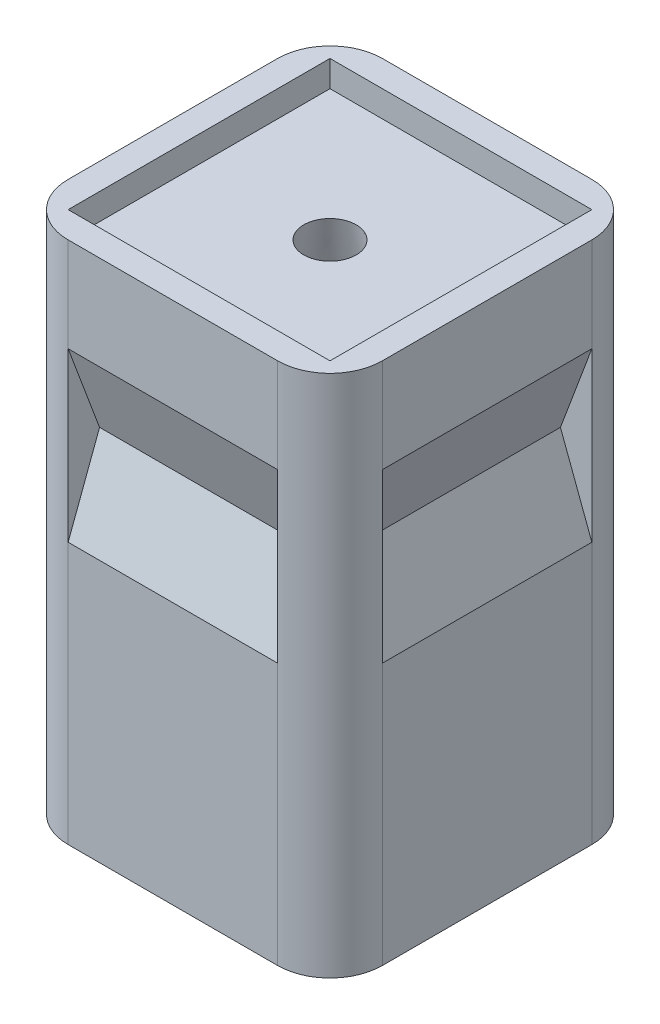
ISO-10303-21;
HEADER;
FILE_DESCRIPTION(('STEP AP214'),'2;1');
FILE_NAME('part.step','',(''),(''),'','','');
FILE_SCHEMA(('AUTOMOTIVE_DESIGN { 1 0 10303 214 1 1 1 1 }'));
ENDSEC;
DATA;
#1=APPLICATION_CONTEXT('core data for automotive mechanical design processes');
#2=APPLICATION_PROTOCOL_DEFINITION('international standard','automotive_design',2000,#1);
#3=PRODUCT_CONTEXT('',#1,'mechanical');
#4=PRODUCT('Part','Part','',(#3));
#5=PRODUCT_RELATED_PRODUCT_CATEGORY('part','',(#4));
#6=PRODUCT_DEFINITION_FORMATION('','',#4);
#7=PRODUCT_DEFINITION_CONTEXT('part definition',#1,'design');
#8=PRODUCT_DEFINITION('design','',#6,#7);
#9=PRODUCT_DEFINITION_SHAPE('','',#8);
#10=(LENGTH_UNIT() NAMED_UNIT(*) SI_UNIT(.MILLI.,.METRE.));
#11=(NAMED_UNIT(*) PLANE_ANGLE_UNIT() SI_UNIT($,.RADIAN.));
#12=(NAMED_UNIT(*) SI_UNIT($,.STERADIAN.) SOLID_ANGLE_UNIT());
#13=UNCERTAINTY_MEASURE_WITH_UNIT(LENGTH_MEASURE(1.E-05),#10,'distance_accuracy_value','');
#14=(GEOMETRIC_REPRESENTATION_CONTEXT(3) GLOBAL_UNCERTAINTY_ASSIGNED_CONTEXT((#13)) GLOBAL_UNIT_ASSIGNED_CONTEXT((#10,
#11,#12)) REPRESENTATION_CONTEXT('',''));
#15=CARTESIAN_POINT('',(0.,0.,0.));
#16=DIRECTION('',(0.,0.,1.));
#17=DIRECTION('',(1.,0.,0.));
#18=AXIS2_PLACEMENT_3D('',#15,#16,#17);
#19=CARTESIAN_POINT('',(-15.,50.,15.));
#20=DIRECTION('',(1.,0.,0.));
#21=DIRECTION('',(0.,0.,-1.));
#22=AXIS2_PLACEMENT_3D('',#19,#20,#21);
#23=PLANE('',#22);
#24=DIRECTION('',(0.,0.,-1.));
#25=VECTOR('',#24,1.);
#26=CARTESIAN_POINT('',(-14.9999999999999,41.,10.0000000000002));
#27=LINE('',#26,#25);
#28=CARTESIAN_POINT('',(-14.9999999999999,41.,10.0000000000002));
#29=VERTEX_POINT('',#28);
#30=CARTESIAN_POINT('',(-15.0000000000001,41.,-9.99999999999984));
#31=VERTEX_POINT('',#30);
#32=EDGE_CURVE('E225',#29,#31,#27,.T.);
#33=ORIENTED_EDGE('',*,*,#32,.F.);
#34=DIRECTION('',(0.,-1.,0.));
#35=VECTOR('',#34,1.);
#36=CARTESIAN_POINT('',(-15.,50.,10.));
#37=LINE('',#36,#35);
#38=CARTESIAN_POINT('',(-15.,50.,10.));
#39=VERTEX_POINT('',#38);
#40=EDGE_CURVE('E407',#29,#39,#37,.F.);
#41=ORIENTED_EDGE('',*,*,#40,.T.);
#42=DIRECTION('',(0.,0.,1.));
#43=VECTOR('',#42,1.);
#44=CARTESIAN_POINT('',(-15.,50.,15.));
#45=LINE('',#44,#43);
#46=CARTESIAN_POINT('',(-15.,50.,-10.));
#47=VERTEX_POINT('',#46);
#48=EDGE_CURVE('E352',#47,#39,#45,.T.);
#49=ORIENTED_EDGE('',*,*,#48,.F.);
#50=DIRECTION('',(0.,-1.,0.));
#51=VECTOR('',#50,1.);
#52=CARTESIAN_POINT('',(-15.,50.,-10.));
#53=LINE('',#52,#51);
#54=EDGE_CURVE('E12',#47,#31,#53,.T.);
#55=ORIENTED_EDGE('',*,*,#54,.T.);
#56=EDGE_LOOP('',(#33,#41,#49,#55));
#57=FACE_BOUND('',#56,.T.);
#58=ADVANCED_FACE('F41',(#57),#23,.F.);
#59=CARTESIAN_POINT('',(-15.,50.,-15.));
#60=DIRECTION('',(0.,0.,1.));
#61=DIRECTION('',(1.,0.,0.));
#62=AXIS2_PLACEMENT_3D('',#59,#60,#61);
#63=PLANE('',#62);
#64=DIRECTION('',(1.,0.,0.));
#65=VECTOR('',#64,1.);
#66=CARTESIAN_POINT('',(-10.,41.,-15.));
#67=LINE('',#66,#65);
#68=CARTESIAN_POINT('',(-10.,41.,-15.));
#69=VERTEX_POINT('',#68);
#70=CARTESIAN_POINT('',(10.,41.,-15.));
#71=VERTEX_POINT('',#70);
#72=EDGE_CURVE('E239',#69,#71,#67,.T.);
#73=ORIENTED_EDGE('',*,*,#72,.F.);
#74=DIRECTION('',(0.,-1.,0.));
#75=VECTOR('',#74,1.);
#76=CARTESIAN_POINT('',(-10.,50.,-15.));
#77=LINE('',#76,#75);
#78=CARTESIAN_POINT('',(-10.,50.,-15.));
#79=VERTEX_POINT('',#78);
#80=EDGE_CURVE('E358',#69,#79,#77,.F.);
#81=ORIENTED_EDGE('',*,*,#80,.T.);
#82=DIRECTION('',(-1.,0.,0.));
#83=VECTOR('',#82,1.);
#84=CARTESIAN_POINT('',(-15.,50.,-15.));
#85=LINE('',#84,#83);
#86=CARTESIAN_POINT('',(10.,50.,-15.));
#87=VERTEX_POINT('',#86);
#88=EDGE_CURVE('E348',#87,#79,#85,.T.);
#89=ORIENTED_EDGE('',*,*,#88,.F.);
#90=DIRECTION('',(0.,-1.,0.));
#91=VECTOR('',#90,1.);
#92=CARTESIAN_POINT('',(10.,50.,-15.));
#93=LINE('',#92,#91);
#94=EDGE_CURVE('E373',#87,#71,#93,.T.);
#95=ORIENTED_EDGE('',*,*,#94,.T.);
#96=EDGE_LOOP('',(#73,#81,#89,#95));
#97=FACE_BOUND('',#96,.T.);
#98=ADVANCED_FACE('F448',(#97),#63,.F.);
#99=CARTESIAN_POINT('',(15.,50.,15.));
#100=DIRECTION('',(-1.,0.,0.));
#101=DIRECTION('',(0.,0.,1.));
#102=AXIS2_PLACEMENT_3D('',#99,#100,#101);
#103=PLANE('',#102);
#104=DIRECTION('',(0.,0.,1.));
#105=VECTOR('',#104,1.);
#106=CARTESIAN_POINT('',(15.,41.,-10.));
#107=LINE('',#106,#105);
#108=CARTESIAN_POINT('',(15.,41.,-10.));
#109=VERTEX_POINT('',#108);
#110=CARTESIAN_POINT('',(15.,41.,9.99999999999995));
#111=VERTEX_POINT('',#110);
#112=EDGE_CURVE('E263',#109,#111,#107,.T.);
#113=ORIENTED_EDGE('',*,*,#112,.F.);
#114=DIRECTION('',(0.,-1.,0.));
#115=VECTOR('',#114,1.);
#116=CARTESIAN_POINT('',(15.,50.,-10.));
#117=LINE('',#116,#115);
#118=CARTESIAN_POINT('',(15.,50.,-10.));
#119=VERTEX_POINT('',#118);
#120=EDGE_CURVE('E388',#109,#119,#117,.F.);
#121=ORIENTED_EDGE('',*,*,#120,.T.);
#122=DIRECTION('',(0.,0.,-1.));
#123=VECTOR('',#122,1.);
#124=CARTESIAN_POINT('',(15.,50.,15.));
#125=LINE('',#124,#123);
#126=CARTESIAN_POINT('',(15.,50.,10.));
#127=VERTEX_POINT('',#126);
#128=EDGE_CURVE('E345',#127,#119,#125,.T.);
#129=ORIENTED_EDGE('',*,*,#128,.F.);
#130=DIRECTION('',(0.,-1.,0.));
#131=VECTOR('',#130,1.);
#132=CARTESIAN_POINT('',(15.,50.,10.));
#133=LINE('',#132,#131);
#134=EDGE_CURVE('E385',#127,#111,#133,.T.);
#135=ORIENTED_EDGE('',*,*,#134,.T.);
#136=EDGE_LOOP('',(#113,#121,#129,#135));
#137=FACE_BOUND('',#136,.T.);
#138=ADVANCED_FACE('F437',(#137),#103,.F.);
#139=CARTESIAN_POINT('',(-15.,50.,15.));
#140=DIRECTION('',(0.,0.,-1.));
#141=DIRECTION('',(-1.,0.,0.));
#142=AXIS2_PLACEMENT_3D('',#139,#140,#141);
#143=PLANE('',#142);
#144=DIRECTION('',(-1.,0.,0.));
#145=VECTOR('',#144,1.);
#146=CARTESIAN_POINT('',(10.,41.,15.));
#147=LINE('',#146,#145);
#148=CARTESIAN_POINT('',(10.,41.,15.));
#149=VERTEX_POINT('',#148);
#150=CARTESIAN_POINT('',(-10.,41.,15.));
#151=VERTEX_POINT('',#150);
#152=EDGE_CURVE('E288',#149,#151,#147,.T.);
#153=ORIENTED_EDGE('',*,*,#152,.F.);
#154=DIRECTION('',(0.,-1.,0.));
#155=VECTOR('',#154,1.);
#156=CARTESIAN_POINT('',(10.,50.,15.));
#157=LINE('',#156,#155);
#158=CARTESIAN_POINT('',(10.,50.,15.));
#159=VERTEX_POINT('',#158);
#160=EDGE_CURVE('E404',#149,#159,#157,.F.);
#161=ORIENTED_EDGE('',*,*,#160,.T.);
#162=DIRECTION('',(1.,0.,0.));
#163=VECTOR('',#162,1.);
#164=CARTESIAN_POINT('',(-15.,50.,15.));
#165=LINE('',#164,#163);
#166=CARTESIAN_POINT('',(-10.,50.,15.));
#167=VERTEX_POINT('',#166);
#168=EDGE_CURVE('E355',#167,#159,#165,.T.);
#169=ORIENTED_EDGE('',*,*,#168,.F.);
#170=DIRECTION('',(0.,-1.,0.));
#171=VECTOR('',#170,1.);
#172=CARTESIAN_POINT('',(-10.,50.,15.));
#173=LINE('',#172,#171);
#174=EDGE_CURVE('E401',#167,#151,#173,.T.);
#175=ORIENTED_EDGE('',*,*,#174,.T.);
#176=EDGE_LOOP('',(#153,#161,#169,#175));
#177=FACE_BOUND('',#176,.T.);
#178=ADVANCED_FACE('F426',(#177),#143,.F.);
#179=CARTESIAN_POINT('',(0.,47.5,0.));
#180=DIRECTION('',(0.,-1.,0.));
#181=DIRECTION('',(0.,0.,-1.));
#182=AXIS2_PLACEMENT_3D('',#179,#180,#181);
#183=PLANE('',#182);
#184=DIRECTION('',(0.,0.,-1.));
#185=VECTOR('',#184,1.);
#186=CARTESIAN_POINT('',(12.5,47.5,12.5));
#187=LINE('',#186,#185);
#188=CARTESIAN_POINT('',(12.5,47.5,12.5));
#189=VERTEX_POINT('',#188);
#190=CARTESIAN_POINT('',(12.5,47.5,-12.5));
#191=VERTEX_POINT('',#190);
#192=EDGE_CURVE('E313',#189,#191,#187,.T.);
#193=ORIENTED_EDGE('',*,*,#192,.T.);
#194=DIRECTION('',(-1.,0.,0.));
#195=VECTOR('',#194,1.);
#196=CARTESIAN_POINT('',(-12.5,47.5,-12.5));
#197=LINE('',#196,#195);
#198=CARTESIAN_POINT('',(-12.5,47.5,-12.5));
#199=VERTEX_POINT('',#198);
#200=EDGE_CURVE('E316',#191,#199,#197,.T.);
#201=ORIENTED_EDGE('',*,*,#200,.T.);
#202=DIRECTION('',(0.,0.,1.));
#203=VECTOR('',#202,1.);
#204=CARTESIAN_POINT('',(-12.5,47.5,12.5));
#205=LINE('',#204,#203);
#206=CARTESIAN_POINT('',(-12.5,47.5,12.5));
#207=VERTEX_POINT('',#206);
#208=EDGE_CURVE('E320',#199,#207,#205,.T.);
#209=ORIENTED_EDGE('',*,*,#208,.T.);
#210=DIRECTION('',(1.,0.,0.));
#211=VECTOR('',#210,1.);
#212=CARTESIAN_POINT('',(-12.5,47.5,12.5));
#213=LINE('',#212,#211);
#214=EDGE_CURVE('E323',#207,#189,#213,.T.);
#215=ORIENTED_EDGE('',*,*,#214,.T.);
#216=EDGE_LOOP('',(#193,#201,#209,#215));
#217=FACE_BOUND('',#216,.T.);
#218=CARTESIAN_POINT('',(0.,47.5,0.));
#219=DIRECTION('',(0.,1.,0.));
#220=DIRECTION('',(0.,0.,1.));
#221=AXIS2_PLACEMENT_3D('',#218,#219,#220);
#222=CIRCLE('',#221,2.5);
#223=CARTESIAN_POINT('',(0.784484004687969,47.5,-2.37372804811097));
#224=VERTEX_POINT('',#223);
#225=EDGE_CURVE('E309',#224,#224,#222,.T.);
#226=ORIENTED_EDGE('',*,*,#225,.F.);
#227=EDGE_LOOP('',(#226));
#228=FACE_BOUND('',#227,.T.);
#229=ADVANCED_FACE('F515',(#217,#228),#183,.F.);
#230=CARTESIAN_POINT('',(15.,0.,-10.));
#231=VERTEX_POINT('',#230);
#232=CARTESIAN_POINT('',(15.,25.,-10.));
#233=VERTEX_POINT('',#232);
#234=EDGE_CURVE('E389',#231,#233,#117,.F.);
#235=ORIENTED_EDGE('',*,*,#234,.T.);
#236=DIRECTION('',(0.,0.,1.));
#237=VECTOR('',#236,1.);
#238=CARTESIAN_POINT('',(15.,25.,-10.));
#239=LINE('',#238,#237);
#240=CARTESIAN_POINT('',(15.,25.0000000000001,10.));
#241=VERTEX_POINT('',#240);
#242=EDGE_CURVE('E264',#233,#241,#239,.T.);
#243=ORIENTED_EDGE('',*,*,#242,.T.);
#244=CARTESIAN_POINT('',(15.,0.,10.));
#245=VERTEX_POINT('',#244);
#246=EDGE_CURVE('E384',#241,#245,#133,.T.);
#247=ORIENTED_EDGE('',*,*,#246,.T.);
#248=DIRECTION('',(0.,0.,-1.));
#249=VECTOR('',#248,1.);
#250=CARTESIAN_POINT('',(15.,0.,15.));
#251=LINE('',#250,#249);
#252=EDGE_CURVE('E338',#245,#231,#251,.T.);
#253=ORIENTED_EDGE('',*,*,#252,.T.);
#254=EDGE_LOOP('',(#235,#243,#247,#253));
#255=FACE_BOUND('',#254,.T.);
#256=ADVANCED_FACE('F510',(#255),#103,.F.);
#257=CARTESIAN_POINT('',(-10.,0.,-15.));
#258=VERTEX_POINT('',#257);
#259=CARTESIAN_POINT('',(-10.,25.,-15.));
#260=VERTEX_POINT('',#259);
#261=EDGE_CURVE('E369',#258,#260,#77,.F.);
#262=ORIENTED_EDGE('',*,*,#261,.T.);
#263=DIRECTION('',(1.,0.,0.));
#264=VECTOR('',#263,1.);
#265=CARTESIAN_POINT('',(-10.,25.,-15.));
#266=LINE('',#265,#264);
#267=CARTESIAN_POINT('',(10.,25.,-15.));
#268=VERTEX_POINT('',#267);
#269=EDGE_CURVE('E240',#260,#268,#266,.T.);
#270=ORIENTED_EDGE('',*,*,#269,.T.);
#271=CARTESIAN_POINT('',(10.,0.,-15.));
#272=VERTEX_POINT('',#271);
#273=EDGE_CURVE('E372',#268,#272,#93,.T.);
#274=ORIENTED_EDGE('',*,*,#273,.T.);
#275=DIRECTION('',(-1.,0.,0.));
#276=VECTOR('',#275,1.);
#277=CARTESIAN_POINT('',(-15.,0.,-15.));
#278=LINE('',#277,#276);
#279=EDGE_CURVE('E361',#272,#258,#278,.T.);
#280=ORIENTED_EDGE('',*,*,#279,.T.);
#281=EDGE_LOOP('',(#262,#270,#274,#280));
#282=FACE_BOUND('',#281,.T.);
#283=ADVANCED_FACE('F502',(#282),#63,.F.);
#284=CARTESIAN_POINT('',(-15.,0.,10.));
#285=VERTEX_POINT('',#284);
#286=CARTESIAN_POINT('',(-14.9999999999999,25.,10.0000000000002));
#287=VERTEX_POINT('',#286);
#288=EDGE_CURVE('E408',#285,#287,#37,.F.);
#289=ORIENTED_EDGE('',*,*,#288,.T.);
#290=DIRECTION('',(0.,0.,-1.));
#291=VECTOR('',#290,1.);
#292=CARTESIAN_POINT('',(-14.9999999999999,25.,10.0000000000002));
#293=LINE('',#292,#291);
#294=CARTESIAN_POINT('',(-15.,25.0000000000003,-10.));
#295=VERTEX_POINT('',#294);
#296=EDGE_CURVE('E210',#287,#295,#293,.T.);
#297=ORIENTED_EDGE('',*,*,#296,.T.);
#298=CARTESIAN_POINT('',(-15.,0.,-10.));
#299=VERTEX_POINT('',#298);
#300=EDGE_CURVE('E49',#295,#299,#53,.T.);
#301=ORIENTED_EDGE('',*,*,#300,.T.);
#302=DIRECTION('',(0.,0.,1.));
#303=VECTOR('',#302,1.);
#304=CARTESIAN_POINT('',(-15.,0.,15.));
#305=LINE('',#304,#303);
#306=EDGE_CURVE('E364',#299,#285,#305,.T.);
#307=ORIENTED_EDGE('',*,*,#306,.T.);
#308=EDGE_LOOP('',(#289,#297,#301,#307));
#309=FACE_BOUND('',#308,.T.);
#310=ADVANCED_FACE('F457',(#309),#23,.F.);
#311=CARTESIAN_POINT('',(10.,0.,15.));
#312=VERTEX_POINT('',#311);
#313=CARTESIAN_POINT('',(10.,25.,15.));
#314=VERTEX_POINT('',#313);
#315=EDGE_CURVE('E405',#312,#314,#157,.F.);
#316=ORIENTED_EDGE('',*,*,#315,.T.);
#317=DIRECTION('',(-1.,0.,0.));
#318=VECTOR('',#317,1.);
#319=CARTESIAN_POINT('',(10.,25.,15.));
#320=LINE('',#319,#318);
#321=CARTESIAN_POINT('',(-10.,25.,15.));
#322=VERTEX_POINT('',#321);
#323=EDGE_CURVE('E289',#314,#322,#320,.T.);
#324=ORIENTED_EDGE('',*,*,#323,.T.);
#325=CARTESIAN_POINT('',(-10.,0.,15.));
#326=VERTEX_POINT('',#325);
#327=EDGE_CURVE('E400',#322,#326,#173,.T.);
#328=ORIENTED_EDGE('',*,*,#327,.T.);
#329=DIRECTION('',(1.,0.,0.));
#330=VECTOR('',#329,1.);
#331=CARTESIAN_POINT('',(-15.,0.,15.));
#332=LINE('',#331,#330);
#333=EDGE_CURVE('E349',#326,#312,#332,.T.);
#334=ORIENTED_EDGE('',*,*,#333,.T.);
#335=EDGE_LOOP('',(#316,#324,#328,#334));
#336=FACE_BOUND('',#335,.T.);
#337=ADVANCED_FACE('F467',(#336),#143,.F.);
#338=CARTESIAN_POINT('',(0.,50.,0.));
#339=DIRECTION('',(0.,-1.,0.));
#340=DIRECTION('',(0.,0.,-1.));
#341=AXIS2_PLACEMENT_3D('',#338,#339,#340);
#342=PLANE('',#341);
#343=DIRECTION('',(-1.,0.,0.));
#344=VECTOR('',#343,1.);
#345=CARTESIAN_POINT('',(-12.5,50.,-12.5));
#346=LINE('',#345,#344);
#347=CARTESIAN_POINT('',(12.5,50.,-12.5));
#348=VERTEX_POINT('',#347);
#349=CARTESIAN_POINT('',(-12.5,50.,-12.5));
#350=VERTEX_POINT('',#349);
#351=EDGE_CURVE('E328',#348,#350,#346,.T.);
#352=ORIENTED_EDGE('',*,*,#351,.F.);
#353=DIRECTION('',(0.,0.,-1.));
#354=VECTOR('',#353,1.);
#355=CARTESIAN_POINT('',(12.5,50.,12.5));
#356=LINE('',#355,#354);
#357=CARTESIAN_POINT('',(12.5,50.,12.5));
#358=VERTEX_POINT('',#357);
#359=EDGE_CURVE('E312',#358,#348,#356,.T.);
#360=ORIENTED_EDGE('',*,*,#359,.F.);
#361=DIRECTION('',(1.,0.,0.));
#362=VECTOR('',#361,1.);
#363=CARTESIAN_POINT('',(-12.5,50.,12.5));
#364=LINE('',#363,#362);
#365=CARTESIAN_POINT('',(-12.5,50.,12.5));
#366=VERTEX_POINT('',#365);
#367=EDGE_CURVE('E317',#366,#358,#364,.T.);
#368=ORIENTED_EDGE('',*,*,#367,.F.);
#369=DIRECTION('',(0.,0.,1.));
#370=VECTOR('',#369,1.);
#371=CARTESIAN_POINT('',(-12.5,50.,12.5));
#372=LINE('',#371,#370);
#373=EDGE_CURVE('E331',#350,#366,#372,.T.);
#374=ORIENTED_EDGE('',*,*,#373,.F.);
#375=EDGE_LOOP('',(#352,#360,#368,#374));
#376=FACE_BOUND('',#375,.T.);
#377=ORIENTED_EDGE('',*,*,#128,.T.);
#378=CARTESIAN_POINT('',(10.,50.,-10.));
#379=DIRECTION('',(0.,-1.,0.));
#380=DIRECTION('',(0.,0.,-1.));
#381=AXIS2_PLACEMENT_3D('',#378,#379,#380);
#382=CIRCLE('',#381,5.);
#383=EDGE_CURVE('E398',#119,#87,#382,.F.);
#384=ORIENTED_EDGE('',*,*,#383,.T.);
#385=ORIENTED_EDGE('',*,*,#88,.T.);
#386=CARTESIAN_POINT('',(-10.,50.,-10.));
#387=DIRECTION('',(0.,-1.,0.));
#388=DIRECTION('',(0.,0.,-1.));
#389=AXIS2_PLACEMENT_3D('',#386,#387,#388);
#390=CIRCLE('',#389,5.);
#391=EDGE_CURVE('E394',#79,#47,#390,.F.);
#392=ORIENTED_EDGE('',*,*,#391,.T.);
#393=ORIENTED_EDGE('',*,*,#48,.T.);
#394=CARTESIAN_POINT('',(-10.,50.,10.));
#395=DIRECTION('',(0.,-1.,0.));
#396=DIRECTION('',(0.,0.,-1.));
#397=AXIS2_PLACEMENT_3D('',#394,#395,#396);
#398=CIRCLE('',#397,5.);
#399=EDGE_CURVE('E392',#39,#167,#398,.F.);
#400=ORIENTED_EDGE('',*,*,#399,.T.);
#401=ORIENTED_EDGE('',*,*,#168,.T.);
#402=CARTESIAN_POINT('',(10.,50.,10.));
#403=DIRECTION('',(0.,-1.,0.));
#404=DIRECTION('',(0.,0.,-1.));
#405=AXIS2_PLACEMENT_3D('',#402,#403,#404);
#406=CIRCLE('',#405,5.);
#407=EDGE_CURVE('E396',#159,#127,#406,.F.);
#408=ORIENTED_EDGE('',*,*,#407,.T.);
#409=EDGE_LOOP('',(#377,#384,#385,#392,#393,#400,#401,#408));
#410=FACE_BOUND('',#409,.T.);
#411=ADVANCED_FACE('F419',(#376,#410),#342,.F.);
#412=CARTESIAN_POINT('',(0.,0.,0.));
#413=DIRECTION('',(0.,-1.,0.));
#414=DIRECTION('',(0.,0.,-1.));
#415=AXIS2_PLACEMENT_3D('',#412,#413,#414);
#416=PLANE('',#415);
#417=CARTESIAN_POINT('',(0.,0.,0.));
#418=DIRECTION('',(0.,-1.,0.));
#419=DIRECTION('',(0.,0.,-1.));
#420=AXIS2_PLACEMENT_3D('',#417,#418,#419);
#421=CIRCLE('',#420,12.5);
#422=CARTESIAN_POINT('',(0.,0.,-12.5));
#423=VERTEX_POINT('',#422);
#424=EDGE_CURVE('E306',#423,#423,#421,.T.);
#425=ORIENTED_EDGE('',*,*,#424,.F.);
#426=EDGE_LOOP('',(#425));
#427=FACE_BOUND('',#426,.T.);
#428=ORIENTED_EDGE('',*,*,#279,.F.);
#429=CARTESIAN_POINT('',(10.,0.,-10.));
#430=DIRECTION('',(0.,-1.,0.));
#431=DIRECTION('',(0.,0.,-1.));
#432=AXIS2_PLACEMENT_3D('',#429,#430,#431);
#433=CIRCLE('',#432,5.);
#434=EDGE_CURVE('E382',#272,#231,#433,.T.);
#435=ORIENTED_EDGE('',*,*,#434,.T.);
#436=ORIENTED_EDGE('',*,*,#252,.F.);
#437=CARTESIAN_POINT('',(10.,0.,10.));
#438=DIRECTION('',(0.,-1.,0.));
#439=DIRECTION('',(0.,0.,-1.));
#440=AXIS2_PLACEMENT_3D('',#437,#438,#439);
#441=CIRCLE('',#440,5.);
#442=EDGE_CURVE('E380',#245,#312,#441,.T.);
#443=ORIENTED_EDGE('',*,*,#442,.T.);
#444=ORIENTED_EDGE('',*,*,#333,.F.);
#445=CARTESIAN_POINT('',(-10.,0.,10.));
#446=DIRECTION('',(0.,-1.,0.));
#447=DIRECTION('',(0.,0.,-1.));
#448=AXIS2_PLACEMENT_3D('',#445,#446,#447);
#449=CIRCLE('',#448,5.);
#450=EDGE_CURVE('E376',#326,#285,#449,.T.);
#451=ORIENTED_EDGE('',*,*,#450,.T.);
#452=ORIENTED_EDGE('',*,*,#306,.F.);
#453=CARTESIAN_POINT('',(-10.,0.,-10.));
#454=DIRECTION('',(0.,-1.,0.));
#455=DIRECTION('',(0.,0.,-1.));
#456=AXIS2_PLACEMENT_3D('',#453,#454,#455);
#457=CIRCLE('',#456,5.);
#458=EDGE_CURVE('E378',#299,#258,#457,.T.);
#459=ORIENTED_EDGE('',*,*,#458,.T.);
#460=EDGE_LOOP('',(#428,#435,#436,#443,#444,#451,#452,#459));
#461=FACE_BOUND('',#460,.T.);
#462=ADVANCED_FACE('F462',(#427,#461),#416,.T.);
#463=CARTESIAN_POINT('',(12.5,47.5,12.5));
#464=DIRECTION('',(1.,0.,0.));
#465=DIRECTION('',(0.,0.,-1.));
#466=AXIS2_PLACEMENT_3D('',#463,#464,#465);
#467=PLANE('',#466);
#468=ORIENTED_EDGE('',*,*,#359,.T.);
#469=DIRECTION('',(0.,1.,0.));
#470=VECTOR('',#469,1.);
#471=CARTESIAN_POINT('',(12.5,47.5,-12.5));
#472=LINE('',#471,#470);
#473=EDGE_CURVE('E326',#191,#348,#472,.T.);
#474=ORIENTED_EDGE('',*,*,#473,.F.);
#475=ORIENTED_EDGE('',*,*,#192,.F.);
#476=DIRECTION('',(0.,1.,0.));
#477=VECTOR('',#476,1.);
#478=CARTESIAN_POINT('',(12.5,47.5,12.5));
#479=LINE('',#478,#477);
#480=EDGE_CURVE('E336',#189,#358,#479,.T.);
#481=ORIENTED_EDGE('',*,*,#480,.T.);
#482=EDGE_LOOP('',(#468,#474,#475,#481));
#483=FACE_BOUND('',#482,.T.);
#484=ADVANCED_FACE('F734',(#483),#467,.F.);
#485=CARTESIAN_POINT('',(-12.5,47.5,12.5));
#486=DIRECTION('',(0.,0.,1.));
#487=DIRECTION('',(1.,0.,0.));
#488=AXIS2_PLACEMENT_3D('',#485,#486,#487);
#489=PLANE('',#488);
#490=ORIENTED_EDGE('',*,*,#367,.T.);
#491=ORIENTED_EDGE('',*,*,#480,.F.);
#492=ORIENTED_EDGE('',*,*,#214,.F.);
#493=DIRECTION('',(0.,1.,0.));
#494=VECTOR('',#493,1.);
#495=CARTESIAN_POINT('',(-12.5,47.5,12.5));
#496=LINE('',#495,#494);
#497=EDGE_CURVE('E339',#207,#366,#496,.T.);
#498=ORIENTED_EDGE('',*,*,#497,.T.);
#499=EDGE_LOOP('',(#490,#491,#492,#498));
#500=FACE_BOUND('',#499,.T.);
#501=ADVANCED_FACE('F725',(#500),#489,.F.);
#502=CARTESIAN_POINT('',(-12.5,47.5,12.5));
#503=DIRECTION('',(-1.,0.,0.));
#504=DIRECTION('',(0.,0.,1.));
#505=AXIS2_PLACEMENT_3D('',#502,#503,#504);
#506=PLANE('',#505);
#507=ORIENTED_EDGE('',*,*,#373,.T.);
#508=ORIENTED_EDGE('',*,*,#497,.F.);
#509=ORIENTED_EDGE('',*,*,#208,.F.);
#510=DIRECTION('',(0.,1.,0.));
#511=VECTOR('',#510,1.);
#512=CARTESIAN_POINT('',(-12.5,47.5,-12.5));
#513=LINE('',#512,#511);
#514=EDGE_CURVE('E341',#199,#350,#513,.T.);
#515=ORIENTED_EDGE('',*,*,#514,.T.);
#516=EDGE_LOOP('',(#507,#508,#509,#515));
#517=FACE_BOUND('',#516,.T.);
#518=ADVANCED_FACE('F716',(#517),#506,.F.);
#519=CARTESIAN_POINT('',(-12.5,47.5,-12.5));
#520=DIRECTION('',(0.,0.,-1.));
#521=DIRECTION('',(-1.,0.,0.));
#522=AXIS2_PLACEMENT_3D('',#519,#520,#521);
#523=PLANE('',#522);
#524=ORIENTED_EDGE('',*,*,#351,.T.);
#525=ORIENTED_EDGE('',*,*,#514,.F.);
#526=ORIENTED_EDGE('',*,*,#200,.F.);
#527=ORIENTED_EDGE('',*,*,#473,.T.);
#528=EDGE_LOOP('',(#524,#525,#526,#527));
#529=FACE_BOUND('',#528,.T.);
#530=ADVANCED_FACE('F520',(#529),#523,.F.);
#531=CARTESIAN_POINT('',(10.,50.,-10.));
#532=DIRECTION('',(0.,-1.,0.));
#533=DIRECTION('',(0.,0.,-1.));
#534=AXIS2_PLACEMENT_3D('',#531,#532,#533);
#535=CYLINDRICAL_SURFACE('',#534,5.);
#536=ORIENTED_EDGE('',*,*,#383,.F.);
#537=ORIENTED_EDGE('',*,*,#120,.F.);
#538=DIRECTION('',(0.,1.,0.));
#539=VECTOR('',#538,1.);
#540=CARTESIAN_POINT('',(15.,41.,-10.));
#541=LINE('',#540,#539);
#542=EDGE_CURVE('E258',#233,#109,#541,.T.);
#543=ORIENTED_EDGE('',*,*,#542,.F.);
#544=ORIENTED_EDGE('',*,*,#234,.F.);
#545=ORIENTED_EDGE('',*,*,#434,.F.);
#546=ORIENTED_EDGE('',*,*,#273,.F.);
#547=DIRECTION('',(0.,1.,0.));
#548=VECTOR('',#547,1.);
#549=CARTESIAN_POINT('',(10.,41.,-15.));
#550=LINE('',#549,#548);
#551=EDGE_CURVE('E64',#268,#71,#550,.T.);
#552=ORIENTED_EDGE('',*,*,#551,.T.);
#553=ORIENTED_EDGE('',*,*,#94,.F.);
#554=EDGE_LOOP('',(#536,#537,#543,#544,#545,#546,#552,#553));
#555=FACE_BOUND('',#554,.T.);
#556=ADVANCED_FACE('F443',(#555),#535,.T.);
#557=CARTESIAN_POINT('',(10.,50.,10.));
#558=DIRECTION('',(0.,-1.,0.));
#559=DIRECTION('',(0.,0.,-1.));
#560=AXIS2_PLACEMENT_3D('',#557,#558,#559);
#561=CYLINDRICAL_SURFACE('',#560,5.);
#562=ORIENTED_EDGE('',*,*,#407,.F.);
#563=ORIENTED_EDGE('',*,*,#160,.F.);
#564=DIRECTION('',(0.,1.,0.));
#565=VECTOR('',#564,1.);
#566=CARTESIAN_POINT('',(10.,41.,15.));
#567=LINE('',#566,#565);
#568=EDGE_CURVE('E283',#314,#149,#567,.T.);
#569=ORIENTED_EDGE('',*,*,#568,.F.);
#570=ORIENTED_EDGE('',*,*,#315,.F.);
#571=ORIENTED_EDGE('',*,*,#442,.F.);
#572=ORIENTED_EDGE('',*,*,#246,.F.);
#573=DIRECTION('',(0.,1.,0.));
#574=VECTOR('',#573,1.);
#575=CARTESIAN_POINT('',(15.,41.,9.99999999999995));
#576=LINE('',#575,#574);
#577=EDGE_CURVE('E262',#241,#111,#576,.T.);
#578=ORIENTED_EDGE('',*,*,#577,.T.);
#579=ORIENTED_EDGE('',*,*,#134,.F.);
#580=EDGE_LOOP('',(#562,#563,#569,#570,#571,#572,#578,#579));
#581=FACE_BOUND('',#580,.T.);
#582=ADVANCED_FACE('F432',(#581),#561,.T.);
#583=CARTESIAN_POINT('',(-10.,50.,-10.));
#584=DIRECTION('',(0.,-1.,0.));
#585=DIRECTION('',(0.,0.,-1.));
#586=AXIS2_PLACEMENT_3D('',#583,#584,#585);
#587=CYLINDRICAL_SURFACE('',#586,5.);
#588=ORIENTED_EDGE('',*,*,#391,.F.);
#589=ORIENTED_EDGE('',*,*,#80,.F.);
#590=DIRECTION('',(0.,1.,0.));
#591=VECTOR('',#590,1.);
#592=CARTESIAN_POINT('',(-10.,41.,-15.));
#593=LINE('',#592,#591);
#594=EDGE_CURVE('E236',#260,#69,#593,.T.);
#595=ORIENTED_EDGE('',*,*,#594,.F.);
#596=ORIENTED_EDGE('',*,*,#261,.F.);
#597=ORIENTED_EDGE('',*,*,#458,.F.);
#598=ORIENTED_EDGE('',*,*,#300,.F.);
#599=DIRECTION('',(0.,1.,0.));
#600=VECTOR('',#599,1.);
#601=CARTESIAN_POINT('',(-15.0000000000001,41.,-9.99999999999984));
#602=LINE('',#601,#600);
#603=EDGE_CURVE('E56',#295,#31,#602,.T.);
#604=ORIENTED_EDGE('',*,*,#603,.T.);
#605=ORIENTED_EDGE('',*,*,#54,.F.);
#606=EDGE_LOOP('',(#588,#589,#595,#596,#597,#598,#604,#605));
#607=FACE_BOUND('',#606,.T.);
#608=ADVANCED_FACE('F451',(#607),#587,.T.);
#609=CARTESIAN_POINT('',(-10.,50.,10.));
#610=DIRECTION('',(0.,-1.,0.));
#611=DIRECTION('',(0.,0.,-1.));
#612=AXIS2_PLACEMENT_3D('',#609,#610,#611);
#613=CYLINDRICAL_SURFACE('',#612,5.);
#614=ORIENTED_EDGE('',*,*,#399,.F.);
#615=ORIENTED_EDGE('',*,*,#40,.F.);
#616=DIRECTION('',(0.,1.,0.));
#617=VECTOR('',#616,1.);
#618=CARTESIAN_POINT('',(-14.9999999999999,41.,10.0000000000002));
#619=LINE('',#618,#617);
#620=EDGE_CURVE('E214',#287,#29,#619,.T.);
#621=ORIENTED_EDGE('',*,*,#620,.F.);
#622=ORIENTED_EDGE('',*,*,#288,.F.);
#623=ORIENTED_EDGE('',*,*,#450,.F.);
#624=ORIENTED_EDGE('',*,*,#327,.F.);
#625=DIRECTION('',(0.,1.,0.));
#626=VECTOR('',#625,1.);
#627=CARTESIAN_POINT('',(-10.,41.,15.));
#628=LINE('',#627,#626);
#629=EDGE_CURVE('E287',#322,#151,#628,.T.);
#630=ORIENTED_EDGE('',*,*,#629,.T.);
#631=ORIENTED_EDGE('',*,*,#174,.F.);
#632=EDGE_LOOP('',(#614,#615,#621,#622,#623,#624,#630,#631));
#633=FACE_BOUND('',#632,.T.);
#634=ADVANCED_FACE('F43',(#633),#613,.T.);
#635=CARTESIAN_POINT('',(0.,0.,-12.5));
#636=CARTESIAN_POINT('',(0.784484004687969,47.5,-2.37372804811097));
#637=CARTESIAN_POINT('',(-25.,0.,-12.5));
#638=CARTESIAN_POINT('',(-3.96297209153398,47.5,-3.94269605748691));
#639=CARTESIAN_POINT('',(-25.,0.,12.5));
#640=CARTESIAN_POINT('',(-5.53194010090991,47.5,0.804760038735037));
#641=CARTESIAN_POINT('',(0.,0.,12.5));
#642=CARTESIAN_POINT('',(-0.784484004687968,47.5,2.37372804811097));
#643=CARTESIAN_POINT('',(25.,0.,12.5));
#644=CARTESIAN_POINT('',(3.96297209153398,47.5,3.94269605748691));
#645=CARTESIAN_POINT('',(25.,0.,-12.5));
#646=CARTESIAN_POINT('',(5.53194010090991,47.5,-0.804760038735038));
#647=CARTESIAN_POINT('',(0.,0.,-12.5));
#648=CARTESIAN_POINT('',(0.784484004687969,47.5,-2.37372804811097));
#649=(BOUNDED_SURFACE() B_SPLINE_SURFACE(3,1,((#635,#636),(#637,#638),(#639,#640),(#641,#642),
(#643,#644),(#645,#646),(#647,#648)),.UNSPECIFIED.,.T.,.F.,.F.) B_SPLINE_SURFACE_WITH_KNOTS((4,
3,4),(2,2),(0.,0.5,1.),(0.,1.),
.UNSPECIFIED.) GEOMETRIC_REPRESENTATION_ITEM() RATIONAL_B_SPLINE_SURFACE(((1.,1.),
(0.333333333333333,0.333333333333333),(0.333333333333333,0.333333333333333),(1.,1.),
(0.333333333333333,0.333333333333333),(0.333333333333333,0.333333333333333),(1.,1.))) REPRESENTATION_ITEM('') SURFACE());
#650=CARTESIAN_POINT('',(0.,0.,-12.5));
#651=CARTESIAN_POINT('',(0.00817170838216634,0.494791666666667,-12.3945180005012));
#652=CARTESIAN_POINT('',(0.0163434167643327,0.989583333333334,-12.2890360010023));
#653=CARTESIAN_POINT('',(0.0326868335286654,1.97916666666667,-12.0780720020046));
#654=CARTESIAN_POINT('',(0.0408585419108317,2.47395833333333,-11.9725900025058));
#655=CARTESIAN_POINT('',(0.0572019586751644,3.46354166666667,-11.7616260035081));
#656=CARTESIAN_POINT('',(0.0653736670573307,3.95833333333333,-11.6561440040092));
#657=CARTESIAN_POINT('',(0.0817170838216634,4.94791666666667,-11.4451800050116));
#658=CARTESIAN_POINT('',(0.0898887922038297,5.44270833333333,-11.3396980055127));
#659=CARTESIAN_POINT('',(0.106232208968162,6.43229166666667,-11.128734006515));
#660=CARTESIAN_POINT('',(0.114403917350329,6.92708333333333,-11.0232520070162));
#661=CARTESIAN_POINT('',(0.130747334114661,7.91666666666667,-10.8122880080185));
#662=CARTESIAN_POINT('',(0.138919042496828,8.41145833333333,-10.7068060085197));
#663=CARTESIAN_POINT('',(0.15526245926116,9.40104166666667,-10.495842009522));
#664=CARTESIAN_POINT('',(0.163434167643327,9.89583333333333,-10.3903600100231));
#665=CARTESIAN_POINT('',(0.179777584407659,10.8854166666667,-10.1793960110254));
#666=CARTESIAN_POINT('',(0.187949292789826,11.3802083333333,-10.0739140115266));
#667=CARTESIAN_POINT('',(0.204292709554158,12.3697916666667,-9.8629500125289));
#668=CARTESIAN_POINT('',(0.212464417936325,12.8645833333333,-9.75746801303006));
#669=CARTESIAN_POINT('',(0.228807834700657,13.8541666666667,-9.54650401403237));
#670=CARTESIAN_POINT('',(0.236979543082824,14.3489583333333,-9.44102201453352));
#671=CARTESIAN_POINT('',(0.253322959847157,15.3385416666667,-9.23005801553584));
#672=CARTESIAN_POINT('',(0.261494668229323,15.8333333333333,-9.12457601603699));
#673=CARTESIAN_POINT('',(0.277838084993656,16.8229166666667,-8.9136120170393));
#674=CARTESIAN_POINT('',(0.286009793375822,17.3177083333333,-8.80813001754046));
#675=CARTESIAN_POINT('',(0.302353210140155,18.3072916666667,-8.59716601854277));
#676=CARTESIAN_POINT('',(0.310524918522321,18.8020833333333,-8.49168401904393));
#677=CARTESIAN_POINT('',(0.326868335286654,19.7916666666667,-8.28072002004624));
#678=CARTESIAN_POINT('',(0.33504004366882,20.2864583333333,-8.1752380205474));
#679=CARTESIAN_POINT('',(0.351383460433152,21.2760416666667,-7.96427402154971));
#680=CARTESIAN_POINT('',(0.359555168815319,21.7708333333333,-7.85879202205086));
#681=CARTESIAN_POINT('',(0.375898585579652,22.7604166666667,-7.64782802305317));
#682=CARTESIAN_POINT('',(0.384070293961818,23.2552083333333,-7.54234602355433));
#683=CARTESIAN_POINT('',(0.400413710726151,24.2447916666667,-7.33138202455664));
#684=CARTESIAN_POINT('',(0.408585419108317,24.7395833333333,-7.2259000250578));
#685=CARTESIAN_POINT('',(0.42492883587265,25.7291666666667,-7.01493602606011));
#686=CARTESIAN_POINT('',(0.433100544254816,26.2239583333333,-6.90945402656127));
#687=CARTESIAN_POINT('',(0.449443961019149,27.2135416666667,-6.69849002756358));
#688=CARTESIAN_POINT('',(0.457615669401315,27.7083333333333,-6.59300802806473));
#689=CARTESIAN_POINT('',(0.473959086165648,28.6979166666667,-6.38204402906705));
#690=CARTESIAN_POINT('',(0.482130794547814,29.1927083333333,-6.2765620295682));
#691=CARTESIAN_POINT('',(0.498474211312147,30.1822916666667,-6.06559803057051));
#692=CARTESIAN_POINT('',(0.506645919694313,30.6770833333333,-5.96011603107167));
#693=CARTESIAN_POINT('',(0.522989336458646,31.6666666666667,-5.74915203207398));
#694=CARTESIAN_POINT('',(0.531161044840812,32.1614583333333,-5.64367003257514));
#695=CARTESIAN_POINT('',(0.547504461605145,33.1510416666667,-5.43270603357745));
#696=CARTESIAN_POINT('',(0.555676169987311,33.6458333333333,-5.32722403407861));
#697=CARTESIAN_POINT('',(0.572019586751644,34.6354166666667,-5.11626003508092));
#698=CARTESIAN_POINT('',(0.58019129513381,35.1302083333333,-5.01077803558207));
#699=CARTESIAN_POINT('',(0.596534711898143,36.1197916666667,-4.79981403658439));
#700=CARTESIAN_POINT('',(0.604706420280309,36.6145833333333,-4.69433203708554));
#701=CARTESIAN_POINT('',(0.621049837044642,37.6041666666667,-4.48336803808785));
#702=CARTESIAN_POINT('',(0.629221545426808,38.0989583333333,-4.37788603858901));
#703=CARTESIAN_POINT('',(0.645564962191141,39.0885416666667,-4.16692203959132));
#704=CARTESIAN_POINT('',(0.653736670573307,39.5833333333333,-4.06144004009248));
#705=CARTESIAN_POINT('',(0.67008008733764,40.5729166666667,-3.85047604109479));
#706=CARTESIAN_POINT('',(0.678251795719806,41.0677083333333,-3.74499404159595));
#707=CARTESIAN_POINT('',(0.694595212484139,42.0572916666667,-3.53403004259826));
#708=CARTESIAN_POINT('',(0.702766920866305,42.5520833333333,-3.42854804309941));
#709=CARTESIAN_POINT('',(0.719110337630638,43.5416666666667,-3.21758404410172));
#710=CARTESIAN_POINT('',(0.727282046012804,44.0364583333333,-3.11210204460288));
#711=CARTESIAN_POINT('',(0.743625462777137,45.0260416666667,-2.90113804560519));
#712=CARTESIAN_POINT('',(0.751797171159303,45.5208333333333,-2.79565604610635));
#713=CARTESIAN_POINT('',(0.768140587923636,46.5104166666667,-2.58469204710866));
#714=CARTESIAN_POINT('',(0.776312296305802,47.0052083333333,-2.47921004760982));
#715=CARTESIAN_POINT('',(0.784484004687969,47.5,-2.37372804811097));
#716=B_SPLINE_CURVE_WITH_KNOTS('',3,(#650,#651,#652,#653,#654,#655,#656,#657,#658,#659,#660,
#661,#662,#663,#664,#665,#666,#667,#668,#669,#670,#671,#672,#673,#674,#675,#676,#677,#678,#679,
#680,#681,#682,#683,#684,#685,#686,#687,#688,#689,#690,#691,#692,#693,#694,#695,#696,#697,#698,
#699,#700,#701,#702,#703,#704,#705,#706,#707,#708,#709,#710,#711,#712,#713,#714,#715),
.UNSPECIFIED.,.F.,.F.,(4,2,2,2,2,2,2,2,2,2,2,2,2,2,2,2,2,2,2,2,2,2,2,2,2,2,2,2,2,2,2,2,4),(0.,
1.51792891860931,3.03585783721861,4.55378675582792,6.07171567443722,7.58964459304653,
9.10757351165583,10.6255024302651,12.1434313488744,13.6613602674837,15.1792891860931,
16.6972181047024,18.2151470233117,19.733075941921,21.2510048605303,22.7689337791396,
24.2868626977489,25.8047916163582,27.3227205349675,28.8406494535768,30.3585783721861,
31.8765072907954,33.3944362094047,34.912365128014,36.4302940466233,37.9482229652326,
39.4661518838419,40.9840808024513,42.5020097210606,44.0199386396699,45.5378675582792,
47.0557964768885,48.5737253954978),.UNSPECIFIED.);
#717=EDGE_CURVE('BSEAM482',#423,#224,#716,.T.);
#718=ORIENTED_EDGE('',*,*,#424,.T.);
#719=ORIENTED_EDGE('',*,*,#225,.T.);
#720=ORIENTED_EDGE('',*,*,#717,.T.);
#721=ORIENTED_EDGE('',*,*,#717,.F.);
#722=EDGE_LOOP('',(#718,#720,#719,#721));
#723=FACE_BOUND('',#722,.T.);
#724=ADVANCED_FACE('F482',(#723),#649,.F.);
#725=CARTESIAN_POINT('',(10.,0.,0.));
#726=DIRECTION('',(-1.,0.,0.));
#727=DIRECTION('',(0.,0.,1.));
#728=AXIS2_PLACEMENT_3D('',#725,#726,#727);
#729=PLANE('',#728);
#730=ORIENTED_EDGE('',*,*,#568,.T.);
#731=DIRECTION('',(0.,-0.936329177569045,-0.351123441588391));
#732=VECTOR('',#731,1.);
#733=CARTESIAN_POINT('',(10.,41.,15.));
#734=LINE('',#733,#732);
#735=CARTESIAN_POINT('',(10.,33.,12.));
#736=VERTEX_POINT('',#735);
#737=EDGE_CURVE('E295',#149,#736,#734,.T.);
#738=ORIENTED_EDGE('',*,*,#737,.T.);
#739=DIRECTION('',(0.,-0.936329177569045,0.351123441588392));
#740=VECTOR('',#739,1.);
#741=CARTESIAN_POINT('',(10.,33.,12.));
#742=LINE('',#741,#740);
#743=EDGE_CURVE('E281',#736,#314,#742,.T.);
#744=ORIENTED_EDGE('',*,*,#743,.T.);
#745=EDGE_LOOP('',(#730,#738,#744));
#746=FACE_BOUND('',#745,.T.);
#747=ADVANCED_FACE('F469',(#746),#729,.T.);
#748=CARTESIAN_POINT('',(-10.,0.,0.));
#749=DIRECTION('',(-1.,0.,0.));
#750=DIRECTION('',(0.,0.,1.));
#751=AXIS2_PLACEMENT_3D('',#748,#749,#750);
#752=PLANE('',#751);
#753=ORIENTED_EDGE('',*,*,#629,.F.);
#754=DIRECTION('',(0.,-0.936329177569045,0.351123441588392));
#755=VECTOR('',#754,1.);
#756=CARTESIAN_POINT('',(-10.,33.,12.));
#757=LINE('',#756,#755);
#758=CARTESIAN_POINT('',(-10.,33.,12.));
#759=VERTEX_POINT('',#758);
#760=EDGE_CURVE('E284',#759,#322,#757,.T.);
#761=ORIENTED_EDGE('',*,*,#760,.F.);
#762=DIRECTION('',(0.,-0.936329177569045,-0.351123441588391));
#763=VECTOR('',#762,1.);
#764=CARTESIAN_POINT('',(-10.,41.,15.));
#765=LINE('',#764,#763);
#766=EDGE_CURVE('E300',#151,#759,#765,.T.);
#767=ORIENTED_EDGE('',*,*,#766,.F.);
#768=EDGE_LOOP('',(#753,#761,#767));
#769=FACE_BOUND('',#768,.T.);
#770=ADVANCED_FACE('F476',(#769),#752,.F.);
#771=CARTESIAN_POINT('',(10.,33.,12.));
#772=DIRECTION('',(0.,-0.351123441588392,-0.936329177569044));
#773=DIRECTION('',(0.,0.936329177569045,-0.351123441588392));
#774=AXIS2_PLACEMENT_3D('',#771,#772,#773);
#775=PLANE('',#774);
#776=ORIENTED_EDGE('',*,*,#323,.F.);
#777=ORIENTED_EDGE('',*,*,#743,.F.);
#778=DIRECTION('',(-1.,0.,0.));
#779=VECTOR('',#778,1.);
#780=CARTESIAN_POINT('',(10.,33.,12.));
#781=LINE('',#780,#779);
#782=EDGE_CURVE('E292',#736,#759,#781,.T.);
#783=ORIENTED_EDGE('',*,*,#782,.T.);
#784=ORIENTED_EDGE('',*,*,#760,.T.);
#785=EDGE_LOOP('',(#776,#777,#783,#784));
#786=FACE_BOUND('',#785,.T.);
#787=ADVANCED_FACE('F473',(#786),#775,.F.);
#788=CARTESIAN_POINT('',(10.,41.,15.));
#789=DIRECTION('',(0.,0.351123441588391,-0.936329177569045));
#790=DIRECTION('',(0.,0.936329177569045,0.351123441588391));
#791=AXIS2_PLACEMENT_3D('',#788,#789,#790);
#792=PLANE('',#791);
#793=ORIENTED_EDGE('',*,*,#766,.T.);
#794=ORIENTED_EDGE('',*,*,#782,.F.);
#795=ORIENTED_EDGE('',*,*,#737,.F.);
#796=ORIENTED_EDGE('',*,*,#152,.T.);
#797=EDGE_LOOP('',(#793,#794,#795,#796));
#798=FACE_BOUND('',#797,.T.);
#799=ADVANCED_FACE('F478',(#798),#792,.F.);
#800=CARTESIAN_POINT('',(0.,0.,-10.));
#801=DIRECTION('',(0.,0.,1.));
#802=DIRECTION('',(1.,0.,0.));
#803=AXIS2_PLACEMENT_3D('',#800,#801,#802);
#804=PLANE('',#803);
#805=ORIENTED_EDGE('',*,*,#542,.T.);
#806=DIRECTION('',(-0.351123441588391,-0.936329177569045,0.));
#807=VECTOR('',#806,1.);
#808=CARTESIAN_POINT('',(15.,41.,-10.));
#809=LINE('',#808,#807);
#810=CARTESIAN_POINT('',(12.,33.,-10.));
#811=VERTEX_POINT('',#810);
#812=EDGE_CURVE('E270',#109,#811,#809,.T.);
#813=ORIENTED_EDGE('',*,*,#812,.T.);
#814=DIRECTION('',(0.351123441588392,-0.936329177569045,0.));
#815=VECTOR('',#814,1.);
#816=CARTESIAN_POINT('',(12.,33.,-10.));
#817=LINE('',#816,#815);
#818=EDGE_CURVE('E256',#811,#233,#817,.T.);
#819=ORIENTED_EDGE('',*,*,#818,.T.);
#820=EDGE_LOOP('',(#805,#813,#819));
#821=FACE_BOUND('',#820,.T.);
#822=ADVANCED_FACE('F480',(#821),#804,.T.);
#823=CARTESIAN_POINT('',(0.,0.,10.));
#824=DIRECTION('',(0.,0.,1.));
#825=DIRECTION('',(1.,0.,0.));
#826=AXIS2_PLACEMENT_3D('',#823,#824,#825);
#827=PLANE('',#826);
#828=ORIENTED_EDGE('',*,*,#577,.F.);
#829=DIRECTION('',(0.351123441588392,-0.936329177569045,0.));
#830=VECTOR('',#829,1.);
#831=CARTESIAN_POINT('',(12.,33.,9.99999999999996));
#832=LINE('',#831,#830);
#833=CARTESIAN_POINT('',(12.,33.,9.99999999999996));
#834=VERTEX_POINT('',#833);
#835=EDGE_CURVE('E259',#834,#241,#832,.T.);
#836=ORIENTED_EDGE('',*,*,#835,.F.);
#837=DIRECTION('',(-0.351123441588391,-0.936329177569045,0.));
#838=VECTOR('',#837,1.);
#839=CARTESIAN_POINT('',(15.,41.,9.99999999999995));
#840=LINE('',#839,#838);
#841=EDGE_CURVE('E275',#111,#834,#840,.T.);
#842=ORIENTED_EDGE('',*,*,#841,.F.);
#843=EDGE_LOOP('',(#828,#836,#842));
#844=FACE_BOUND('',#843,.T.);
#845=ADVANCED_FACE('F488',(#844),#827,.F.);
#846=CARTESIAN_POINT('',(12.,33.,-10.));
#847=DIRECTION('',(-0.936329177569044,-0.351123441588392,0.));
#848=DIRECTION('',(0.351123441588392,-0.936329177569045,0.));
#849=AXIS2_PLACEMENT_3D('',#846,#847,#848);
#850=PLANE('',#849);
#851=ORIENTED_EDGE('',*,*,#242,.F.);
#852=ORIENTED_EDGE('',*,*,#818,.F.);
#853=DIRECTION('',(0.,0.,1.));
#854=VECTOR('',#853,1.);
#855=CARTESIAN_POINT('',(12.,33.,-10.));
#856=LINE('',#855,#854);
#857=EDGE_CURVE('E267',#811,#834,#856,.T.);
#858=ORIENTED_EDGE('',*,*,#857,.T.);
#859=ORIENTED_EDGE('',*,*,#835,.T.);
#860=EDGE_LOOP('',(#851,#852,#858,#859));
#861=FACE_BOUND('',#860,.T.);
#862=ADVANCED_FACE('F541',(#861),#850,.F.);
#863=CARTESIAN_POINT('',(15.,41.,-10.));
#864=DIRECTION('',(-0.936329177569045,0.351123441588391,0.));
#865=DIRECTION('',(-0.351123441588391,-0.936329177569045,0.));
#866=AXIS2_PLACEMENT_3D('',#863,#864,#865);
#867=PLANE('',#866);
#868=ORIENTED_EDGE('',*,*,#841,.T.);
#869=ORIENTED_EDGE('',*,*,#857,.F.);
#870=ORIENTED_EDGE('',*,*,#812,.F.);
#871=ORIENTED_EDGE('',*,*,#112,.T.);
#872=EDGE_LOOP('',(#868,#869,#870,#871));
#873=FACE_BOUND('',#872,.T.);
#874=ADVANCED_FACE('F550',(#873),#867,.F.);
#875=CARTESIAN_POINT('',(-10.,0.,0.));
#876=DIRECTION('',(1.,0.,0.));
#877=DIRECTION('',(0.,0.,-1.));
#878=AXIS2_PLACEMENT_3D('',#875,#876,#877);
#879=PLANE('',#878);
#880=ORIENTED_EDGE('',*,*,#594,.T.);
#881=DIRECTION('',(0.,-0.936329177569045,0.351123441588391));
#882=VECTOR('',#881,1.);
#883=CARTESIAN_POINT('',(-10.,41.,-15.));
#884=LINE('',#883,#882);
#885=CARTESIAN_POINT('',(-10.,33.,-12.));
#886=VERTEX_POINT('',#885);
#887=EDGE_CURVE('E246',#69,#886,#884,.T.);
#888=ORIENTED_EDGE('',*,*,#887,.T.);
#889=DIRECTION('',(0.,-0.936329177569045,-0.351123441588392));
#890=VECTOR('',#889,1.);
#891=CARTESIAN_POINT('',(-10.,33.,-12.));
#892=LINE('',#891,#890);
#893=EDGE_CURVE('E234',#886,#260,#892,.T.);
#894=ORIENTED_EDGE('',*,*,#893,.T.);
#895=EDGE_LOOP('',(#880,#888,#894));
#896=FACE_BOUND('',#895,.T.);
#897=ADVANCED_FACE('F559',(#896),#879,.T.);
#898=CARTESIAN_POINT('',(10.,0.,0.));
#899=DIRECTION('',(1.,0.,0.));
#900=DIRECTION('',(0.,0.,-1.));
#901=AXIS2_PLACEMENT_3D('',#898,#899,#900);
#902=PLANE('',#901);
#903=ORIENTED_EDGE('',*,*,#551,.F.);
#904=DIRECTION('',(0.,-0.936329177569045,-0.351123441588392));
#905=VECTOR('',#904,1.);
#906=CARTESIAN_POINT('',(10.,33.,-12.));
#907=LINE('',#906,#905);
#908=CARTESIAN_POINT('',(10.,33.,-12.));
#909=VERTEX_POINT('',#908);
#910=EDGE_CURVE('E237',#909,#268,#907,.T.);
#911=ORIENTED_EDGE('',*,*,#910,.F.);
#912=DIRECTION('',(0.,-0.936329177569045,0.351123441588391));
#913=VECTOR('',#912,1.);
#914=CARTESIAN_POINT('',(10.,41.,-15.));
#915=LINE('',#914,#913);
#916=EDGE_CURVE('E250',#71,#909,#915,.T.);
#917=ORIENTED_EDGE('',*,*,#916,.F.);
#918=EDGE_LOOP('',(#903,#911,#917));
#919=FACE_BOUND('',#918,.T.);
#920=ADVANCED_FACE('F568',(#919),#902,.F.);
#921=CARTESIAN_POINT('',(-10.,33.,-12.));
#922=DIRECTION('',(0.,-0.351123441588392,0.936329177569044));
#923=DIRECTION('',(0.,-0.936329177569045,-0.351123441588392));
#924=AXIS2_PLACEMENT_3D('',#921,#922,#923);
#925=PLANE('',#924);
#926=ORIENTED_EDGE('',*,*,#269,.F.);
#927=ORIENTED_EDGE('',*,*,#893,.F.);
#928=DIRECTION('',(1.,0.,0.));
#929=VECTOR('',#928,1.);
#930=CARTESIAN_POINT('',(-10.,33.,-12.));
#931=LINE('',#930,#929);
#932=EDGE_CURVE('E243',#886,#909,#931,.T.);
#933=ORIENTED_EDGE('',*,*,#932,.T.);
#934=ORIENTED_EDGE('',*,*,#910,.T.);
#935=EDGE_LOOP('',(#926,#927,#933,#934));
#936=FACE_BOUND('',#935,.T.);
#937=ADVANCED_FACE('F577',(#936),#925,.F.);
#938=CARTESIAN_POINT('',(-10.,41.,-15.));
#939=DIRECTION('',(0.,0.351123441588391,0.936329177569045));
#940=DIRECTION('',(0.,-0.936329177569045,0.351123441588391));
#941=AXIS2_PLACEMENT_3D('',#938,#939,#940);
#942=PLANE('',#941);
#943=ORIENTED_EDGE('',*,*,#916,.T.);
#944=ORIENTED_EDGE('',*,*,#932,.F.);
#945=ORIENTED_EDGE('',*,*,#887,.F.);
#946=ORIENTED_EDGE('',*,*,#72,.T.);
#947=EDGE_LOOP('',(#943,#944,#945,#946));
#948=FACE_BOUND('',#947,.T.);
#949=ADVANCED_FACE('F491',(#948),#942,.F.);
#950=CARTESIAN_POINT('',(1.04083408558608E-13,0.,10.));
#951=DIRECTION('',(0.,0.,-1.));
#952=DIRECTION('',(-1.,0.,0.));
#953=AXIS2_PLACEMENT_3D('',#950,#951,#952);
#954=PLANE('',#953);
#955=ORIENTED_EDGE('',*,*,#620,.T.);
#956=DIRECTION('',(0.351123441588391,-0.936329177569045,0.));
#957=VECTOR('',#956,1.);
#958=CARTESIAN_POINT('',(-14.9999999999999,41.,10.0000000000002));
#959=LINE('',#958,#957);
#960=CARTESIAN_POINT('',(-11.9999999999999,33.,10.0000000000001));
#961=VERTEX_POINT('',#960);
#962=EDGE_CURVE('E216',#29,#961,#959,.T.);
#963=ORIENTED_EDGE('',*,*,#962,.T.);
#964=DIRECTION('',(-0.351123441588392,-0.936329177569045,0.));
#965=VECTOR('',#964,1.);
#966=CARTESIAN_POINT('',(-11.9999999999999,33.,10.0000000000001));
#967=LINE('',#966,#965);
#968=EDGE_CURVE('E204',#961,#287,#967,.T.);
#969=ORIENTED_EDGE('',*,*,#968,.T.);
#970=EDGE_LOOP('',(#955,#963,#969));
#971=FACE_BOUND('',#970,.T.);
#972=ADVANCED_FACE('F217',(#971),#954,.T.);
#973=CARTESIAN_POINT('',(-1.05818132034585E-13,0.,-10.));
#974=DIRECTION('',(0.,0.,-1.));
#975=DIRECTION('',(-1.,0.,0.));
#976=AXIS2_PLACEMENT_3D('',#973,#974,#975);
#977=PLANE('',#976);
#978=ORIENTED_EDGE('',*,*,#603,.F.);
#979=DIRECTION('',(-0.351123441588392,-0.936329177569045,0.));
#980=VECTOR('',#979,1.);
#981=CARTESIAN_POINT('',(-12.0000000000001,33.,-9.99999999999987));
#982=LINE('',#981,#980);
#983=CARTESIAN_POINT('',(-12.0000000000001,33.,-9.99999999999987));
#984=VERTEX_POINT('',#983);
#985=EDGE_CURVE('E231',#984,#295,#982,.T.);
#986=ORIENTED_EDGE('',*,*,#985,.F.);
#987=DIRECTION('',(0.351123441588391,-0.936329177569045,0.));
#988=VECTOR('',#987,1.);
#989=CARTESIAN_POINT('',(-15.0000000000001,41.,-9.99999999999984));
#990=LINE('',#989,#988);
#991=EDGE_CURVE('E223',#31,#984,#990,.T.);
#992=ORIENTED_EDGE('',*,*,#991,.F.);
#993=EDGE_LOOP('',(#978,#986,#992));
#994=FACE_BOUND('',#993,.T.);
#995=ADVANCED_FACE('F601',(#994),#977,.F.);
#996=CARTESIAN_POINT('',(-11.9999999999999,33.,10.0000000000001));
#997=DIRECTION('',(0.936329177569044,-0.351123441588392,0.));
#998=DIRECTION('',(0.351123441588392,0.936329177569045,0.));
#999=AXIS2_PLACEMENT_3D('',#996,#997,#998);
#1000=PLANE('',#999);
#1001=ORIENTED_EDGE('',*,*,#296,.F.);
#1002=ORIENTED_EDGE('',*,*,#968,.F.);
#1003=DIRECTION('',(0.,0.,-1.));
#1004=VECTOR('',#1003,1.);
#1005=CARTESIAN_POINT('',(-11.9999999999999,33.,10.0000000000001));
#1006=LINE('',#1005,#1004);
#1007=EDGE_CURVE('E208',#961,#984,#1006,.T.);
#1008=ORIENTED_EDGE('',*,*,#1007,.T.);
#1009=ORIENTED_EDGE('',*,*,#985,.T.);
#1010=EDGE_LOOP('',(#1001,#1002,#1008,#1009));
#1011=FACE_BOUND('',#1010,.T.);
#1012=ADVANCED_FACE('F206',(#1011),#1000,.F.);
#1013=CARTESIAN_POINT('',(-14.9999999999999,41.,10.0000000000002));
#1014=DIRECTION('',(0.936329177569045,0.351123441588391,0.));
#1015=DIRECTION('',(-0.351123441588391,0.936329177569045,0.));
#1016=AXIS2_PLACEMENT_3D('',#1013,#1014,#1015);
#1017=PLANE('',#1016);
#1018=ORIENTED_EDGE('',*,*,#991,.T.);
#1019=ORIENTED_EDGE('',*,*,#1007,.F.);
#1020=ORIENTED_EDGE('',*,*,#962,.F.);
#1021=ORIENTED_EDGE('',*,*,#32,.T.);
#1022=EDGE_LOOP('',(#1018,#1019,#1020,#1021));
#1023=FACE_BOUND('',#1022,.T.);
#1024=ADVANCED_FACE('F222',(#1023),#1017,.F.);
#1025=CLOSED_SHELL('',(#58,#98,#138,#178,#229,#256,#283,#310,#337,#411,#462,#484,#501,#518,#530,
#556,#582,#608,#634,#724,#747,#770,#787,#799,#822,#845,#862,#874,#897,#920,#937,#949,#972,#995,
#1012,#1024));
#1026=MANIFOLD_SOLID_BREP('B2',#1025);
#1027=ADVANCED_BREP_SHAPE_REPRESENTATION('',(#18,#1026),#14);
#1028=SHAPE_DEFINITION_REPRESENTATION(#9,#1027);
ENDSEC;
END-ISO-10303-21;
